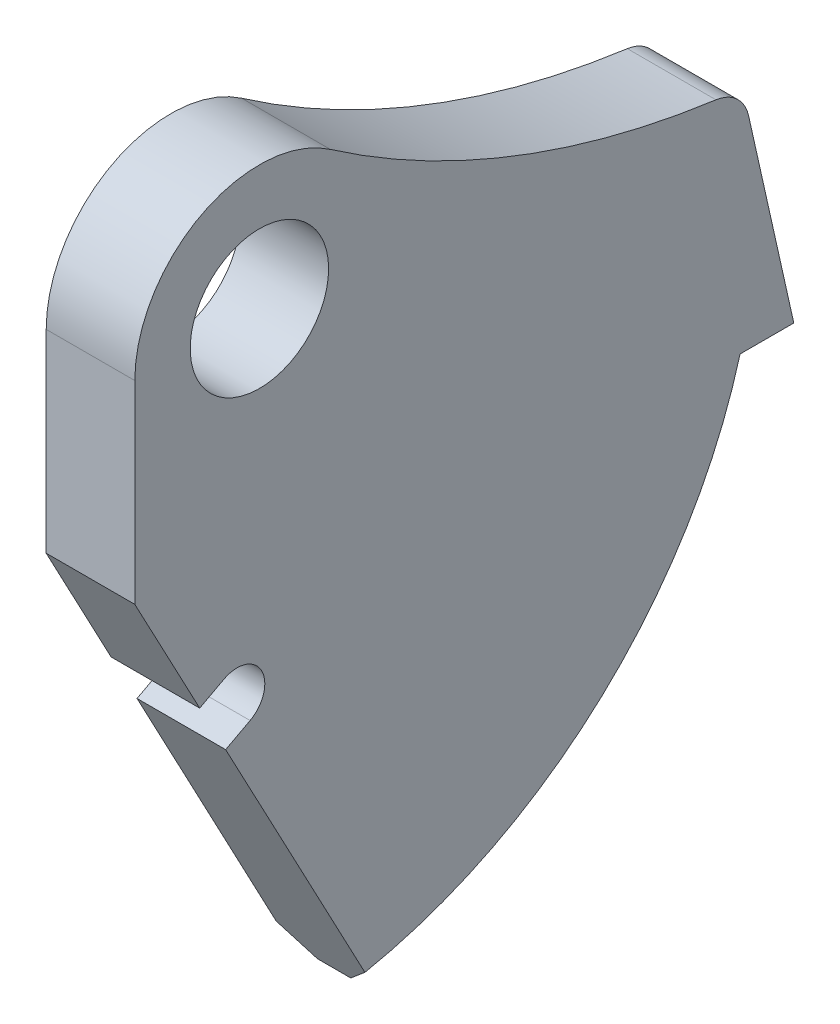
ISO-10303-21;
HEADER;
FILE_DESCRIPTION(('STEP AP214'),'2;1');
FILE_NAME('part.step','',(''),(''),'','','');
FILE_SCHEMA(('AUTOMOTIVE_DESIGN { 1 0 10303 214 1 1 1 1 }'));
ENDSEC;
DATA;
#1=APPLICATION_CONTEXT('core data for automotive mechanical design processes');
#2=APPLICATION_PROTOCOL_DEFINITION('international standard','automotive_design',2000,#1);
#3=PRODUCT_CONTEXT('',#1,'mechanical');
#4=PRODUCT('Part','Part','',(#3));
#5=PRODUCT_RELATED_PRODUCT_CATEGORY('part','',(#4));
#6=PRODUCT_DEFINITION_FORMATION('','',#4);
#7=PRODUCT_DEFINITION_CONTEXT('part definition',#1,'design');
#8=PRODUCT_DEFINITION('design','',#6,#7);
#9=PRODUCT_DEFINITION_SHAPE('','',#8);
#10=(LENGTH_UNIT() NAMED_UNIT(*) SI_UNIT(.MILLI.,.METRE.));
#11=(NAMED_UNIT(*) PLANE_ANGLE_UNIT() SI_UNIT($,.RADIAN.));
#12=(NAMED_UNIT(*) SI_UNIT($,.STERADIAN.) SOLID_ANGLE_UNIT());
#13=UNCERTAINTY_MEASURE_WITH_UNIT(LENGTH_MEASURE(1.E-05),#10,'distance_accuracy_value','');
#14=(GEOMETRIC_REPRESENTATION_CONTEXT(3) GLOBAL_UNCERTAINTY_ASSIGNED_CONTEXT((#13)) GLOBAL_UNIT_ASSIGNED_CONTEXT((#10,
#11,#12)) REPRESENTATION_CONTEXT('',''));
#15=CARTESIAN_POINT('',(0.,0.,0.));
#16=DIRECTION('',(0.,0.,1.));
#17=DIRECTION('',(1.,0.,0.));
#18=AXIS2_PLACEMENT_3D('',#15,#16,#17);
#19=CARTESIAN_POINT('',(8.,-59.1577763228436,4.02293737805009));
#20=DIRECTION('',(1.,0.,0.));
#21=DIRECTION('',(0.,0.,-1.));
#22=AXIS2_PLACEMENT_3D('',#19,#20,#21);
#23=PLANE('',#22);
#24=DIRECTION('',(0.,-0.883371462481142,-0.46867351031814));
#25=VECTOR('',#24,1.);
#26=CARTESIAN_POINT('',(8.,-65.91800118684,6.0964271388651));
#27=LINE('',#26,#25);
#28=CARTESIAN_POINT('',(8.,-65.91800118684,6.0964271388651));
#29=VERTEX_POINT('',#28);
#30=CARTESIAN_POINT('',(8.,-113.330807316679,-19.0584790661555));
#31=VERTEX_POINT('',#30);
#32=EDGE_CURVE('E464',#29,#31,#27,.T.);
#33=ORIENTED_EDGE('',*,*,#32,.T.);
#34=CARTESIAN_POINT('',(8.,-27.,-2.00000000000002));
#35=DIRECTION('',(1.,0.,0.));
#36=DIRECTION('',(0.,0.,-1.));
#37=AXIS2_PLACEMENT_3D('',#34,#35,#36);
#38=CIRCLE('',#37,88.);
#39=CARTESIAN_POINT('',(8.,-50.5,-86.8041862174268));
#40=VERTEX_POINT('',#39);
#41=EDGE_CURVE('E413',#31,#40,#38,.T.);
#42=ORIENTED_EDGE('',*,*,#41,.T.);
#43=DIRECTION('',(0.,0.,-1.));
#44=VECTOR('',#43,1.);
#45=CARTESIAN_POINT('',(8.,-50.4999999999999,-96.5));
#46=LINE('',#45,#44);
#47=CARTESIAN_POINT('',(8.,-50.4999999999999,-96.5));
#48=VERTEX_POINT('',#47);
#49=EDGE_CURVE('E250',#40,#48,#46,.T.);
#50=ORIENTED_EDGE('',*,*,#49,.T.);
#51=DIRECTION('',(0.,0.975894971762002,0.218240702183715));
#52=VECTOR('',#51,1.);
#53=CARTESIAN_POINT('',(8.,-50.4999999999999,-96.5));
#54=LINE('',#53,#52);
#55=CARTESIAN_POINT('',(8.,-13.972315084714,-88.331264802334));
#56=VERTEX_POINT('',#55);
#57=EDGE_CURVE('E467',#48,#56,#54,.T.);
#58=ORIENTED_EDGE('',*,*,#57,.T.);
#59=CARTESIAN_POINT('',(8.,-15.5000000000001,-81.5));
#60=DIRECTION('',(1.,0.,0.));
#61=DIRECTION('',(0.,0.,-1.));
#62=AXIS2_PLACEMENT_3D('',#59,#60,#61);
#63=CIRCLE('',#62,7.00000000000001);
#64=CARTESIAN_POINT('',(8.,-8.56372348611467,-82.4423736641704));
#65=VERTEX_POINT('',#64);
#66=EDGE_CURVE('E469',#56,#65,#63,.T.);
#67=ORIENTED_EDGE('',*,*,#66,.T.);
#68=CARTESIAN_POINT('',(8.,149.979739688409,-103.982343130924));
#69=DIRECTION('',(-1.,0.,0.));
#70=DIRECTION('',(0.,0.,-1.));
#71=AXIS2_PLACEMENT_3D('',#68,#69,#70);
#72=CIRCLE('',#71,160.);
#73=CARTESIAN_POINT('',(8.,18.4906528382969,-12.8197409339496));
#74=VERTEX_POINT('',#73);
#75=EDGE_CURVE('E471',#65,#74,#72,.T.);
#76=ORIENTED_EDGE('',*,*,#75,.T.);
#77=CARTESIAN_POINT('',(8.,0.,0.));
#78=DIRECTION('',(1.,0.,0.));
#79=DIRECTION('',(0.,0.,-1.));
#80=AXIS2_PLACEMENT_3D('',#77,#78,#79);
#81=CIRCLE('',#80,22.5);
#82=CARTESIAN_POINT('',(8.,0.,22.5));
#83=VERTEX_POINT('',#82);
#84=EDGE_CURVE('E473',#74,#83,#81,.T.);
#85=ORIENTED_EDGE('',*,*,#84,.T.);
#86=DIRECTION('',(0.,-1.,0.));
#87=VECTOR('',#86,1.);
#88=CARTESIAN_POINT('',(8.,0.,22.5));
#89=LINE('',#88,#87);
#90=CARTESIAN_POINT('',(8.,-34.9999999999999,22.5));
#91=VERTEX_POINT('',#90);
#92=EDGE_CURVE('E475',#83,#91,#89,.T.);
#93=ORIENTED_EDGE('',*,*,#92,.T.);
#94=DIRECTION('',(0.,-0.883371462481143,-0.46867351031814));
#95=VECTOR('',#94,1.);
#96=CARTESIAN_POINT('',(8.,-34.9999999999999,22.5));
#97=LINE('',#96,#95);
#98=CARTESIAN_POINT('',(8.,-57.0842865620286,10.7831622420465));
#99=VERTEX_POINT('',#98);
#100=EDGE_CURVE('E354',#91,#99,#97,.T.);
#101=ORIENTED_EDGE('',*,*,#100,.T.);
#102=DIRECTION('',(0.,0.468673510318138,-0.883371462481143));
#103=VECTOR('',#102,1.);
#104=CARTESIAN_POINT('',(8.,-57.0842865620286,10.7831622420465));
#105=LINE('',#104,#103);
#106=CARTESIAN_POINT('',(8.,-54.7409190104379,6.36630492964078));
#107=VERTEX_POINT('',#106);
#108=EDGE_CURVE('E349',#99,#107,#105,.T.);
#109=ORIENTED_EDGE('',*,*,#108,.T.);
#110=CARTESIAN_POINT('',(8.,-59.1577763228436,4.02293737805009));
#111=DIRECTION('',(-1.,0.,0.));
#112=DIRECTION('',(0.,0.,-1.));
#113=AXIS2_PLACEMENT_3D('',#110,#111,#112);
#114=CIRCLE('',#113,5.);
#115=CARTESIAN_POINT('',(8.,-63.5746336352493,1.67956982645939));
#116=VERTEX_POINT('',#115);
#117=EDGE_CURVE('E338',#107,#116,#114,.T.);
#118=ORIENTED_EDGE('',*,*,#117,.T.);
#119=DIRECTION('',(0.,-0.468673510318143,0.883371462481141));
#120=VECTOR('',#119,1.);
#121=CARTESIAN_POINT('',(8.,-65.91800118684,6.0964271388651));
#122=LINE('',#121,#120);
#123=EDGE_CURVE('E348',#116,#29,#122,.T.);
#124=ORIENTED_EDGE('',*,*,#123,.T.);
#125=EDGE_LOOP('',(#33,#42,#50,#58,#67,#76,#85,#93,#101,#109,#118,#124));
#126=FACE_BOUND('',#125,.T.);
#127=CARTESIAN_POINT('',(8.,0.,0.));
#128=DIRECTION('',(1.,0.,0.));
#129=DIRECTION('',(0.,0.,-1.));
#130=AXIS2_PLACEMENT_3D('',#127,#128,#129);
#131=CIRCLE('',#130,12.5);
#132=CARTESIAN_POINT('',(8.,0.,-12.5));
#133=VERTEX_POINT('',#132);
#134=EDGE_CURVE('E455',#133,#133,#131,.T.);
#135=ORIENTED_EDGE('',*,*,#134,.F.);
#136=EDGE_LOOP('',(#135));
#137=FACE_BOUND('',#136,.T.);
#138=ADVANCED_FACE('F230',(#126,#137),#23,.T.);
#139=CARTESIAN_POINT('',(-8.,-59.1577763228436,4.02293737805009));
#140=DIRECTION('',(1.,0.,0.));
#141=DIRECTION('',(0.,0.,-1.));
#142=AXIS2_PLACEMENT_3D('',#139,#140,#141);
#143=PLANE('',#142);
#144=DIRECTION('',(0.,0.,-1.));
#145=VECTOR('',#144,1.);
#146=CARTESIAN_POINT('',(-8.,-50.4999999999999,-96.5));
#147=LINE('',#146,#145);
#148=CARTESIAN_POINT('',(-8.,-50.5,-86.8041862174268));
#149=VERTEX_POINT('',#148);
#150=CARTESIAN_POINT('',(-8.,-50.4999999999999,-96.5));
#151=VERTEX_POINT('',#150);
#152=EDGE_CURVE('E487',#149,#151,#147,.T.);
#153=ORIENTED_EDGE('',*,*,#152,.F.);
#154=CARTESIAN_POINT('',(-8.,-27.,-2.00000000000002));
#155=DIRECTION('',(1.,0.,0.));
#156=DIRECTION('',(0.,0.,-1.));
#157=AXIS2_PLACEMENT_3D('',#154,#155,#156);
#158=CIRCLE('',#157,88.);
#159=CARTESIAN_POINT('',(-8.,-113.330807316679,-19.0584790661555));
#160=VERTEX_POINT('',#159);
#161=EDGE_CURVE('E373',#149,#160,#158,.F.);
#162=ORIENTED_EDGE('',*,*,#161,.T.);
#163=DIRECTION('',(0.,-0.883371462481142,-0.46867351031814));
#164=VECTOR('',#163,1.);
#165=CARTESIAN_POINT('',(-8.,-65.91800118684,6.0964271388651));
#166=LINE('',#165,#164);
#167=CARTESIAN_POINT('',(-8.,-65.91800118684,6.0964271388651));
#168=VERTEX_POINT('',#167);
#169=EDGE_CURVE('E484',#168,#160,#166,.T.);
#170=ORIENTED_EDGE('',*,*,#169,.F.);
#171=DIRECTION('',(0.,-0.468673510318143,0.883371462481141));
#172=VECTOR('',#171,1.);
#173=CARTESIAN_POINT('',(-8.,-65.91800118684,6.0964271388651));
#174=LINE('',#173,#172);
#175=CARTESIAN_POINT('',(-8.,-63.5746336352493,1.67956982645939));
#176=VERTEX_POINT('',#175);
#177=EDGE_CURVE('E482',#176,#168,#174,.T.);
#178=ORIENTED_EDGE('',*,*,#177,.F.);
#179=CARTESIAN_POINT('',(-8.,-59.1577763228436,4.02293737805009));
#180=DIRECTION('',(-1.,0.,0.));
#181=DIRECTION('',(0.,0.,-1.));
#182=AXIS2_PLACEMENT_3D('',#179,#180,#181);
#183=CIRCLE('',#182,5.);
#184=CARTESIAN_POINT('',(-8.,-54.7409190104379,6.36630492964078));
#185=VERTEX_POINT('',#184);
#186=EDGE_CURVE('E480',#185,#176,#183,.T.);
#187=ORIENTED_EDGE('',*,*,#186,.F.);
#188=DIRECTION('',(0.,0.468673510318138,-0.883371462481143));
#189=VECTOR('',#188,1.);
#190=CARTESIAN_POINT('',(-8.,-57.0842865620286,10.7831622420465));
#191=LINE('',#190,#189);
#192=CARTESIAN_POINT('',(-8.,-57.0842865620286,10.7831622420465));
#193=VERTEX_POINT('',#192);
#194=EDGE_CURVE('E362',#193,#185,#191,.T.);
#195=ORIENTED_EDGE('',*,*,#194,.F.);
#196=DIRECTION('',(0.,-0.883371462481143,-0.46867351031814));
#197=VECTOR('',#196,1.);
#198=CARTESIAN_POINT('',(-8.,-34.9999999999999,22.5));
#199=LINE('',#198,#197);
#200=CARTESIAN_POINT('',(-8.,-34.9999999999999,22.5));
#201=VERTEX_POINT('',#200);
#202=EDGE_CURVE('E358',#201,#193,#199,.T.);
#203=ORIENTED_EDGE('',*,*,#202,.F.);
#204=DIRECTION('',(0.,-1.,0.));
#205=VECTOR('',#204,1.);
#206=CARTESIAN_POINT('',(-8.,0.,22.5));
#207=LINE('',#206,#205);
#208=CARTESIAN_POINT('',(-8.,0.,22.5));
#209=VERTEX_POINT('',#208);
#210=EDGE_CURVE('E497',#209,#201,#207,.T.);
#211=ORIENTED_EDGE('',*,*,#210,.F.);
#212=CARTESIAN_POINT('',(-8.,0.,0.));
#213=DIRECTION('',(1.,0.,0.));
#214=DIRECTION('',(0.,0.,-1.));
#215=AXIS2_PLACEMENT_3D('',#212,#213,#214);
#216=CIRCLE('',#215,22.5);
#217=CARTESIAN_POINT('',(-8.,18.4906528382969,-12.8197409339496));
#218=VERTEX_POINT('',#217);
#219=EDGE_CURVE('E495',#218,#209,#216,.T.);
#220=ORIENTED_EDGE('',*,*,#219,.F.);
#221=CARTESIAN_POINT('',(-8.,149.979739688409,-103.982343130924));
#222=DIRECTION('',(-1.,0.,0.));
#223=DIRECTION('',(0.,0.,-1.));
#224=AXIS2_PLACEMENT_3D('',#221,#222,#223);
#225=CIRCLE('',#224,160.);
#226=CARTESIAN_POINT('',(-8.,-8.56372348611467,-82.4423736641704));
#227=VERTEX_POINT('',#226);
#228=EDGE_CURVE('E493',#227,#218,#225,.T.);
#229=ORIENTED_EDGE('',*,*,#228,.F.);
#230=CARTESIAN_POINT('',(-8.,-15.5000000000001,-81.5));
#231=DIRECTION('',(1.,0.,0.));
#232=DIRECTION('',(0.,0.,-1.));
#233=AXIS2_PLACEMENT_3D('',#230,#231,#232);
#234=CIRCLE('',#233,7.00000000000001);
#235=CARTESIAN_POINT('',(-8.,-13.972315084714,-88.331264802334));
#236=VERTEX_POINT('',#235);
#237=EDGE_CURVE('E491',#236,#227,#234,.T.);
#238=ORIENTED_EDGE('',*,*,#237,.F.);
#239=DIRECTION('',(0.,0.975894971762002,0.218240702183715));
#240=VECTOR('',#239,1.);
#241=CARTESIAN_POINT('',(-8.,-50.4999999999999,-96.5));
#242=LINE('',#241,#240);
#243=EDGE_CURVE('E489',#151,#236,#242,.T.);
#244=ORIENTED_EDGE('',*,*,#243,.F.);
#245=EDGE_LOOP('',(#153,#162,#170,#178,#187,#195,#203,#211,#220,#229,#238,#244));
#246=FACE_BOUND('',#245,.T.);
#247=CARTESIAN_POINT('',(-8.,0.,0.));
#248=DIRECTION('',(1.,0.,0.));
#249=DIRECTION('',(0.,0.,-1.));
#250=AXIS2_PLACEMENT_3D('',#247,#248,#249);
#251=CIRCLE('',#250,12.5);
#252=CARTESIAN_POINT('',(-8.,0.,-12.5));
#253=VERTEX_POINT('',#252);
#254=EDGE_CURVE('E458',#253,#253,#251,.T.);
#255=ORIENTED_EDGE('',*,*,#254,.T.);
#256=EDGE_LOOP('',(#255));
#257=FACE_BOUND('',#256,.T.);
#258=ADVANCED_FACE('F401',(#246,#257),#143,.F.);
#259=CARTESIAN_POINT('',(8.,-57.0842865620286,10.7831622420465));
#260=DIRECTION('',(0.,0.883371462481143,0.468673510318138));
#261=DIRECTION('',(0.,-0.468673510318138,0.883371462481143));
#262=AXIS2_PLACEMENT_3D('',#259,#260,#261);
#263=PLANE('',#262);
#264=ORIENTED_EDGE('',*,*,#194,.T.);
#265=DIRECTION('',(-1.,0.,0.));
#266=VECTOR('',#265,1.);
#267=CARTESIAN_POINT('',(8.,-54.7409190104379,6.36630492964078));
#268=LINE('',#267,#266);
#269=EDGE_CURVE('E342',#107,#185,#268,.T.);
#270=ORIENTED_EDGE('',*,*,#269,.F.);
#271=ORIENTED_EDGE('',*,*,#108,.F.);
#272=DIRECTION('',(-1.,0.,0.));
#273=VECTOR('',#272,1.);
#274=CARTESIAN_POINT('',(8.,-57.0842865620286,10.7831622420465));
#275=LINE('',#274,#273);
#276=EDGE_CURVE('E478',#99,#193,#275,.T.);
#277=ORIENTED_EDGE('',*,*,#276,.T.);
#278=EDGE_LOOP('',(#264,#270,#271,#277));
#279=FACE_BOUND('',#278,.T.);
#280=ADVANCED_FACE('F360',(#279),#263,.F.);
#281=CARTESIAN_POINT('',(8.,-59.1577763228436,4.02293737805009));
#282=DIRECTION('',(-1.,0.,0.));
#283=DIRECTION('',(0.,0.,1.));
#284=AXIS2_PLACEMENT_3D('',#281,#282,#283);
#285=CYLINDRICAL_SURFACE('',#284,5.);
#286=ORIENTED_EDGE('',*,*,#186,.T.);
#287=DIRECTION('',(-1.,0.,0.));
#288=VECTOR('',#287,1.);
#289=CARTESIAN_POINT('',(8.,-63.5746336352493,1.67956982645939));
#290=LINE('',#289,#288);
#291=EDGE_CURVE('E345',#116,#176,#290,.T.);
#292=ORIENTED_EDGE('',*,*,#291,.F.);
#293=ORIENTED_EDGE('',*,*,#117,.F.);
#294=ORIENTED_EDGE('',*,*,#269,.T.);
#295=EDGE_LOOP('',(#286,#292,#293,#294));
#296=FACE_BOUND('',#295,.T.);
#297=ADVANCED_FACE('F340',(#296),#285,.F.);
#298=CARTESIAN_POINT('',(8.,-65.91800118684,6.0964271388651));
#299=DIRECTION('',(0.,-0.883371462481141,-0.468673510318143));
#300=DIRECTION('',(0.,0.468673510318143,-0.883371462481141));
#301=AXIS2_PLACEMENT_3D('',#298,#299,#300);
#302=PLANE('',#301);
#303=ORIENTED_EDGE('',*,*,#177,.T.);
#304=DIRECTION('',(-1.,0.,0.));
#305=VECTOR('',#304,1.);
#306=CARTESIAN_POINT('',(8.,-65.91800118684,6.0964271388651));
#307=LINE('',#306,#305);
#308=EDGE_CURVE('E367',#29,#168,#307,.T.);
#309=ORIENTED_EDGE('',*,*,#308,.F.);
#310=ORIENTED_EDGE('',*,*,#123,.F.);
#311=ORIENTED_EDGE('',*,*,#291,.T.);
#312=EDGE_LOOP('',(#303,#309,#310,#311));
#313=FACE_BOUND('',#312,.T.);
#314=ADVANCED_FACE('F393',(#313),#302,.F.);
#315=CARTESIAN_POINT('',(8.,-65.91800118684,6.0964271388651));
#316=DIRECTION('',(0.,0.46867351031814,-0.883371462481143));
#317=DIRECTION('',(0.,0.883371462481143,0.46867351031814));
#318=AXIS2_PLACEMENT_3D('',#315,#316,#317);
#319=PLANE('',#318);
#320=ORIENTED_EDGE('',*,*,#169,.T.);
#321=CARTESIAN_POINT('',(-8.,-113.330807316679,-19.0584790661555));
#322=CARTESIAN_POINT('',(-7.58386090717589,-113.714742738364,-19.2621763435285));
#323=CARTESIAN_POINT('',(-7.16758219071047,-114.098560053716,-19.4658109594825));
#324=CARTESIAN_POINT('',(-6.33475734391845,-114.865967966477,-19.8729599059853));
#325=CARTESIAN_POINT('',(-5.91821121368507,-115.249558563966,-20.0764742365761));
#326=CARTESIAN_POINT('',(-5.0848630939497,-116.01652279297,-20.4833877862692));
#327=CARTESIAN_POINT('',(-4.66806110445456,-116.399896424491,-20.6867870053745));
#328=CARTESIAN_POINT('',(-3.83421181879637,-117.166435713202,-21.0934751026196));
#329=CARTESIAN_POINT('',(-3.41716452254791,-117.54960137032,-21.296763980721));
#330=CARTESIAN_POINT('',(-3.00000000000001,-117.932667397366,-21.5));
#331=B_SPLINE_CURVE_WITH_KNOTS('',3,(#321,#322,#323,#324,#325,#326,#327,#328,#329,#330),
.UNSPECIFIED.,.F.,.F.,(4,2,2,2,4),(0.,1.80516936436458,3.61033809982114,5.41550678698461,
7.22067610302871),.UNSPECIFIED.);
#332=CARTESIAN_POINT('',(-3.00000000000001,-117.932667397366,-21.5));
#333=VERTEX_POINT('',#332);
#334=EDGE_CURVE('E381',#160,#333,#331,.T.);
#335=ORIENTED_EDGE('',*,*,#334,.T.);
#336=DIRECTION('',(-1.,0.,0.));
#337=VECTOR('',#336,1.);
#338=CARTESIAN_POINT('',(8.,-117.932667397366,-21.5));
#339=LINE('',#338,#337);
#340=CARTESIAN_POINT('',(2.99999999999994,-117.932667397366,-21.5));
#341=VERTEX_POINT('',#340);
#342=EDGE_CURVE('E522',#341,#333,#339,.T.);
#343=ORIENTED_EDGE('',*,*,#342,.F.);
#344=CARTESIAN_POINT('',(2.99999999999994,-117.932667397366,-21.5));
#345=CARTESIAN_POINT('',(3.41716452254784,-117.54960137032,-21.296763980721));
#346=CARTESIAN_POINT('',(3.8342118187963,-117.166435713202,-21.0934751026196));
#347=CARTESIAN_POINT('',(4.6680611044545,-116.399896424491,-20.6867870053745));
#348=CARTESIAN_POINT('',(5.08486309394965,-116.01652279297,-20.4833877862692));
#349=CARTESIAN_POINT('',(5.91821121368503,-115.249558563966,-20.0764742365761));
#350=CARTESIAN_POINT('',(6.33475734391841,-114.865967966477,-19.8729599059853));
#351=CARTESIAN_POINT('',(7.16758219071044,-114.098560053716,-19.4658109594825));
#352=CARTESIAN_POINT('',(7.58386090717588,-113.714742738364,-19.2621763435285));
#353=CARTESIAN_POINT('',(8.,-113.330807316679,-19.0584790661555));
#354=B_SPLINE_CURVE_WITH_KNOTS('',3,(#344,#345,#346,#347,#348,#349,#350,#351,#352,#353),
.UNSPECIFIED.,.F.,.F.,(4,2,2,2,4),(0.,1.8051693160441,3.6103380032076,5.41550673866417,
7.22067610302877),.UNSPECIFIED.);
#355=EDGE_CURVE('E258',#341,#31,#354,.T.);
#356=ORIENTED_EDGE('',*,*,#355,.T.);
#357=ORIENTED_EDGE('',*,*,#32,.F.);
#358=ORIENTED_EDGE('',*,*,#308,.T.);
#359=EDGE_LOOP('',(#320,#335,#343,#356,#357,#358));
#360=FACE_BOUND('',#359,.T.);
#361=ADVANCED_FACE('F387',(#360),#319,.F.);
#362=CARTESIAN_POINT('',(8.,-27.,-2.00000000000002));
#363=DIRECTION('',(-1.,0.,0.));
#364=DIRECTION('',(0.,0.,1.));
#365=AXIS2_PLACEMENT_3D('',#362,#363,#364);
#366=CYLINDRICAL_SURFACE('',#365,93.);
#367=ORIENTED_EDGE('',*,*,#342,.T.);
#368=CARTESIAN_POINT('',(-3.00000000000001,-27.,-2.00000000000002));
#369=DIRECTION('',(1.,0.,0.));
#370=DIRECTION('',(0.,0.,-1.));
#371=AXIS2_PLACEMENT_3D('',#368,#369,#370);
#372=CIRCLE('',#371,93.);
#373=CARTESIAN_POINT('',(-3.00000000000001,-50.5,-91.9819426329528));
#374=VERTEX_POINT('',#373);
#375=EDGE_CURVE('E365',#333,#374,#372,.T.);
#376=ORIENTED_EDGE('',*,*,#375,.T.);
#377=DIRECTION('',(-1.,0.,0.));
#378=VECTOR('',#377,1.);
#379=CARTESIAN_POINT('',(8.,-50.5,-91.9819426329528));
#380=LINE('',#379,#378);
#381=CARTESIAN_POINT('',(2.99999999999994,-50.5,-91.9819426329528));
#382=VERTEX_POINT('',#381);
#383=EDGE_CURVE('E519',#382,#374,#380,.T.);
#384=ORIENTED_EDGE('',*,*,#383,.F.);
#385=CARTESIAN_POINT('',(2.99999999999994,-27.,-2.00000000000002));
#386=DIRECTION('',(1.,0.,0.));
#387=DIRECTION('',(0.,0.,-1.));
#388=AXIS2_PLACEMENT_3D('',#385,#386,#387);
#389=CIRCLE('',#388,93.);
#390=EDGE_CURVE('E363',#382,#341,#389,.F.);
#391=ORIENTED_EDGE('',*,*,#390,.T.);
#392=EDGE_LOOP('',(#367,#376,#384,#391));
#393=FACE_BOUND('',#392,.T.);
#394=ADVANCED_FACE('F392',(#393),#366,.T.);
#395=CARTESIAN_POINT('',(8.,-50.4999999999999,-96.5));
#396=DIRECTION('',(0.,1.,0.));
#397=DIRECTION('',(0.,0.,1.));
#398=AXIS2_PLACEMENT_3D('',#395,#396,#397);
#399=PLANE('',#398);
#400=ORIENTED_EDGE('',*,*,#152,.T.);
#401=DIRECTION('',(-1.,0.,0.));
#402=VECTOR('',#401,1.);
#403=CARTESIAN_POINT('',(8.,-50.4999999999999,-96.5));
#404=LINE('',#403,#402);
#405=EDGE_CURVE('E516',#48,#151,#404,.T.);
#406=ORIENTED_EDGE('',*,*,#405,.F.);
#407=ORIENTED_EDGE('',*,*,#49,.F.);
#408=CARTESIAN_POINT('',(8.,-50.5,-86.8041862174268));
#409=CARTESIAN_POINT('',(7.16752869491519,-50.4999999999999,-87.6679780656537));
#410=CARTESIAN_POINT('',(6.3346263728317,-50.4999999999999,-88.5313536940317));
#411=CARTESIAN_POINT('',(4.66795970615313,-50.4999999999999,-90.2572724991956));
#412=CARTESIAN_POINT('',(3.83419536156993,-50.4999999999999,-91.1198156759929));
#413=CARTESIAN_POINT('',(2.99999999999994,-50.5,-91.9819426329528));
#414=B_SPLINE_CURVE_WITH_KNOTS('',3,(#408,#409,#410,#411,#412,#413),.UNSPECIFIED.,.F.,.F.,(4,2,
4),(0.,3.59892953310873,7.19785901661368),.UNSPECIFIED.);
#415=EDGE_CURVE('E12',#40,#382,#414,.T.);
#416=ORIENTED_EDGE('',*,*,#415,.T.);
#417=ORIENTED_EDGE('',*,*,#383,.T.);
#418=CARTESIAN_POINT('',(-3.00000000000001,-50.5,-91.9819426329528));
#419=CARTESIAN_POINT('',(-3.83419536156999,-50.4999999999999,-91.1198156759929));
#420=CARTESIAN_POINT('',(-4.66795970615318,-50.4999999999999,-90.2572724991956));
#421=CARTESIAN_POINT('',(-6.33462637283172,-50.4999999999999,-88.5313536940317));
#422=CARTESIAN_POINT('',(-7.1675286949152,-50.4999999999999,-87.6679780656538));
#423=CARTESIAN_POINT('',(-8.,-50.5,-86.8041862174268));
#424=B_SPLINE_CURVE_WITH_KNOTS('',3,(#418,#419,#420,#421,#422,#423),.UNSPECIFIED.,.F.,.F.,(4,2,
4),(0.,3.59892948350492,7.19785901661361),.UNSPECIFIED.);
#425=EDGE_CURVE('E244',#374,#149,#424,.T.);
#426=ORIENTED_EDGE('',*,*,#425,.T.);
#427=EDGE_LOOP('',(#400,#406,#407,#416,#417,#426));
#428=FACE_BOUND('',#427,.T.);
#429=ADVANCED_FACE('F414',(#428),#399,.F.);
#430=CARTESIAN_POINT('',(8.,-50.4999999999999,-96.5));
#431=DIRECTION('',(0.,-0.218240702183715,0.975894971762002));
#432=DIRECTION('',(0.,-0.975894971762002,-0.218240702183715));
#433=AXIS2_PLACEMENT_3D('',#430,#431,#432);
#434=PLANE('',#433);
#435=ORIENTED_EDGE('',*,*,#243,.T.);
#436=DIRECTION('',(-1.,0.,0.));
#437=VECTOR('',#436,1.);
#438=CARTESIAN_POINT('',(8.,-13.972315084714,-88.331264802334));
#439=LINE('',#438,#437);
#440=EDGE_CURVE('E513',#56,#236,#439,.T.);
#441=ORIENTED_EDGE('',*,*,#440,.F.);
#442=ORIENTED_EDGE('',*,*,#57,.F.);
#443=ORIENTED_EDGE('',*,*,#405,.T.);
#444=EDGE_LOOP('',(#435,#441,#442,#443));
#445=FACE_BOUND('',#444,.T.);
#446=ADVANCED_FACE('F418',(#445),#434,.F.);
#447=CARTESIAN_POINT('',(8.,-15.5000000000001,-81.5));
#448=DIRECTION('',(-1.,0.,0.));
#449=DIRECTION('',(0.,0.,1.));
#450=AXIS2_PLACEMENT_3D('',#447,#448,#449);
#451=CYLINDRICAL_SURFACE('',#450,7.00000000000001);
#452=ORIENTED_EDGE('',*,*,#237,.T.);
#453=DIRECTION('',(-1.,0.,0.));
#454=VECTOR('',#453,1.);
#455=CARTESIAN_POINT('',(8.,-8.56372348611467,-82.4423736641704));
#456=LINE('',#455,#454);
#457=EDGE_CURVE('E510',#65,#227,#456,.T.);
#458=ORIENTED_EDGE('',*,*,#457,.F.);
#459=ORIENTED_EDGE('',*,*,#66,.F.);
#460=ORIENTED_EDGE('',*,*,#440,.T.);
#461=EDGE_LOOP('',(#452,#458,#459,#460));
#462=FACE_BOUND('',#461,.T.);
#463=ADVANCED_FACE('F422',(#462),#451,.T.);
#464=CARTESIAN_POINT('',(8.,149.979739688409,-103.982343130924));
#465=DIRECTION('',(-1.,0.,0.));
#466=DIRECTION('',(0.,0.,1.));
#467=AXIS2_PLACEMENT_3D('',#464,#465,#466);
#468=CYLINDRICAL_SURFACE('',#467,160.);
#469=ORIENTED_EDGE('',*,*,#228,.T.);
#470=DIRECTION('',(-1.,0.,0.));
#471=VECTOR('',#470,1.);
#472=CARTESIAN_POINT('',(8.,18.4906528382969,-12.8197409339496));
#473=LINE('',#472,#471);
#474=EDGE_CURVE('E507',#74,#218,#473,.T.);
#475=ORIENTED_EDGE('',*,*,#474,.F.);
#476=ORIENTED_EDGE('',*,*,#75,.F.);
#477=ORIENTED_EDGE('',*,*,#457,.T.);
#478=EDGE_LOOP('',(#469,#475,#476,#477));
#479=FACE_BOUND('',#478,.T.);
#480=ADVANCED_FACE('F426',(#479),#468,.F.);
#481=CARTESIAN_POINT('',(8.,0.,0.));
#482=DIRECTION('',(-1.,0.,0.));
#483=DIRECTION('',(0.,0.,1.));
#484=AXIS2_PLACEMENT_3D('',#481,#482,#483);
#485=CYLINDRICAL_SURFACE('',#484,22.5);
#486=ORIENTED_EDGE('',*,*,#219,.T.);
#487=DIRECTION('',(-1.,0.,0.));
#488=VECTOR('',#487,1.);
#489=CARTESIAN_POINT('',(8.,0.,22.5));
#490=LINE('',#489,#488);
#491=EDGE_CURVE('E504',#83,#209,#490,.T.);
#492=ORIENTED_EDGE('',*,*,#491,.F.);
#493=ORIENTED_EDGE('',*,*,#84,.F.);
#494=ORIENTED_EDGE('',*,*,#474,.T.);
#495=EDGE_LOOP('',(#486,#492,#493,#494));
#496=FACE_BOUND('',#495,.T.);
#497=ADVANCED_FACE('F430',(#496),#485,.T.);
#498=CARTESIAN_POINT('',(8.,0.,22.5));
#499=DIRECTION('',(0.,0.,-1.));
#500=DIRECTION('',(0.,1.,0.));
#501=AXIS2_PLACEMENT_3D('',#498,#499,#500);
#502=PLANE('',#501);
#503=ORIENTED_EDGE('',*,*,#210,.T.);
#504=DIRECTION('',(-1.,0.,0.));
#505=VECTOR('',#504,1.);
#506=CARTESIAN_POINT('',(8.,-34.9999999999999,22.5));
#507=LINE('',#506,#505);
#508=EDGE_CURVE('E501',#91,#201,#507,.T.);
#509=ORIENTED_EDGE('',*,*,#508,.F.);
#510=ORIENTED_EDGE('',*,*,#92,.F.);
#511=ORIENTED_EDGE('',*,*,#491,.T.);
#512=EDGE_LOOP('',(#503,#509,#510,#511));
#513=FACE_BOUND('',#512,.T.);
#514=ADVANCED_FACE('F434',(#513),#502,.F.);
#515=CARTESIAN_POINT('',(8.,-34.9999999999999,22.5));
#516=DIRECTION('',(0.,0.46867351031814,-0.883371462481143));
#517=DIRECTION('',(0.,0.883371462481143,0.46867351031814));
#518=AXIS2_PLACEMENT_3D('',#515,#516,#517);
#519=PLANE('',#518);
#520=ORIENTED_EDGE('',*,*,#202,.T.);
#521=ORIENTED_EDGE('',*,*,#276,.F.);
#522=ORIENTED_EDGE('',*,*,#100,.F.);
#523=ORIENTED_EDGE('',*,*,#508,.T.);
#524=EDGE_LOOP('',(#520,#521,#522,#523));
#525=FACE_BOUND('',#524,.T.);
#526=ADVANCED_FACE('F438',(#525),#519,.F.);
#527=CARTESIAN_POINT('',(8.,0.,0.));
#528=DIRECTION('',(-1.,0.,0.));
#529=DIRECTION('',(0.,0.,1.));
#530=AXIS2_PLACEMENT_3D('',#527,#528,#529);
#531=CYLINDRICAL_SURFACE('',#530,12.5);
#532=ORIENTED_EDGE('',*,*,#134,.T.);
#533=EDGE_LOOP('',(#532));
#534=FACE_BOUND('',#533,.T.);
#535=ORIENTED_EDGE('',*,*,#254,.F.);
#536=EDGE_LOOP('',(#535));
#537=FACE_BOUND('',#536,.T.);
#538=ADVANCED_FACE('F405',(#534,#537),#531,.F.);
#539=CARTESIAN_POINT('',(-3.00000000000001,-27.,-2.00000000000002));
#540=DIRECTION('',(1.,0.,0.));
#541=DIRECTION('',(0.,0.,-1.));
#542=AXIS2_PLACEMENT_3D('',#539,#540,#541);
#543=CONICAL_SURFACE('',#542,93.,0.785398163397447);
#544=ORIENTED_EDGE('',*,*,#334,.F.);
#545=ORIENTED_EDGE('',*,*,#161,.F.);
#546=ORIENTED_EDGE('',*,*,#425,.F.);
#547=ORIENTED_EDGE('',*,*,#375,.F.);
#548=EDGE_LOOP('',(#544,#545,#546,#547));
#549=FACE_BOUND('',#548,.T.);
#550=ADVANCED_FACE('F402',(#549),#543,.T.);
#551=CARTESIAN_POINT('',(8.,-27.,-2.00000000000002));
#552=DIRECTION('',(-1.,0.,0.));
#553=DIRECTION('',(0.,0.,1.));
#554=AXIS2_PLACEMENT_3D('',#551,#552,#553);
#555=CONICAL_SURFACE('',#554,88.,0.785398163397444);
#556=ORIENTED_EDGE('',*,*,#355,.F.);
#557=ORIENTED_EDGE('',*,*,#390,.F.);
#558=ORIENTED_EDGE('',*,*,#415,.F.);
#559=ORIENTED_EDGE('',*,*,#41,.F.);
#560=EDGE_LOOP('',(#556,#557,#558,#559));
#561=FACE_BOUND('',#560,.T.);
#562=ADVANCED_FACE('F232',(#561),#555,.T.);
#563=CLOSED_SHELL('',(#138,#258,#280,#297,#314,#361,#394,#429,#446,#463,#480,#497,#514,#526,
#538,#550,#562));
#564=MANIFOLD_SOLID_BREP('B2',#563);
#565=ADVANCED_BREP_SHAPE_REPRESENTATION('',(#18,#564),#14);
#566=SHAPE_DEFINITION_REPRESENTATION(#9,#565);
ENDSEC;
END-ISO-10303-21;
